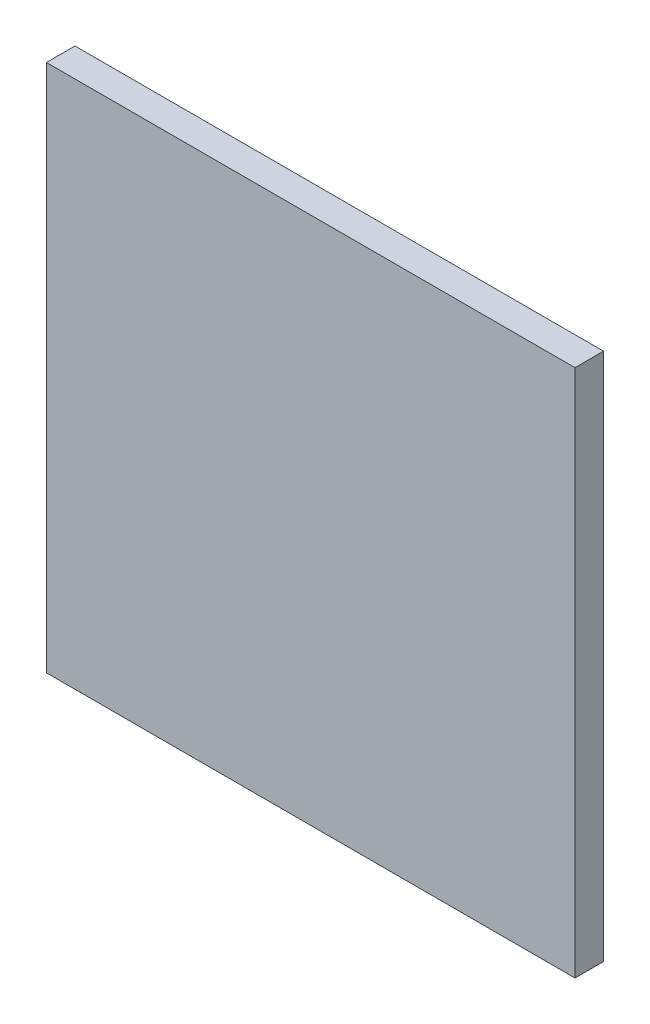
ISO-10303-21;
HEADER;
FILE_DESCRIPTION(('STEP AP214'),'2;1');
FILE_NAME('part.step','',(''),(''),'','','');
FILE_SCHEMA(('AUTOMOTIVE_DESIGN { 1 0 10303 214 1 1 1 1 }'));
ENDSEC;
DATA;
#1=APPLICATION_CONTEXT('core data for automotive mechanical design processes');
#2=APPLICATION_PROTOCOL_DEFINITION('international standard','automotive_design',2000,#1);
#3=PRODUCT_CONTEXT('',#1,'mechanical');
#4=PRODUCT('Part','Part','',(#3));
#5=PRODUCT_RELATED_PRODUCT_CATEGORY('part','',(#4));
#6=PRODUCT_DEFINITION_FORMATION('','',#4);
#7=PRODUCT_DEFINITION_CONTEXT('part definition',#1,'design');
#8=PRODUCT_DEFINITION('design','',#6,#7);
#9=PRODUCT_DEFINITION_SHAPE('','',#8);
#10=(LENGTH_UNIT() NAMED_UNIT(*) SI_UNIT(.MILLI.,.METRE.));
#11=(NAMED_UNIT(*) PLANE_ANGLE_UNIT() SI_UNIT($,.RADIAN.));
#12=(NAMED_UNIT(*) SI_UNIT($,.STERADIAN.) SOLID_ANGLE_UNIT());
#13=UNCERTAINTY_MEASURE_WITH_UNIT(LENGTH_MEASURE(1.E-05),#10,'distance_accuracy_value','');
#14=(GEOMETRIC_REPRESENTATION_CONTEXT(3) GLOBAL_UNCERTAINTY_ASSIGNED_CONTEXT((#13)) GLOBAL_UNIT_ASSIGNED_CONTEXT((#10,
#11,#12)) REPRESENTATION_CONTEXT('',''));
#15=CARTESIAN_POINT('',(0.,0.,0.));
#16=DIRECTION('',(0.,0.,1.));
#17=DIRECTION('',(1.,0.,0.));
#18=AXIS2_PLACEMENT_3D('',#15,#16,#17);
#19=CARTESIAN_POINT('',(605.123437974677,694.281976166603,20.));
#20=DIRECTION('',(0.,1.,0.));
#21=DIRECTION('',(0.,0.,1.));
#22=AXIS2_PLACEMENT_3D('',#19,#20,#21);
#23=PLANE('',#22);
#24=DIRECTION('',(1.,0.,0.));
#25=VECTOR('',#24,1.);
#26=CARTESIAN_POINT('',(605.123437974677,694.281976166603,0.));
#27=LINE('',#26,#25);
#28=CARTESIAN_POINT('',(605.123437974677,694.281976166603,0.));
#29=VERTEX_POINT('',#28);
#30=CARTESIAN_POINT('',(975.123437974677,694.281976166603,0.));
#31=VERTEX_POINT('',#30);
#32=EDGE_CURVE('E102',#29,#31,#27,.T.);
#33=ORIENTED_EDGE('',*,*,#32,.F.);
#34=DIRECTION('',(0.,0.,-1.));
#35=VECTOR('',#34,1.);
#36=CARTESIAN_POINT('',(605.123437974677,694.281976166603,20.));
#37=LINE('',#36,#35);
#38=CARTESIAN_POINT('',(605.123437974677,694.281976166603,20.));
#39=VERTEX_POINT('',#38);
#40=EDGE_CURVE('E11',#39,#29,#37,.T.);
#41=ORIENTED_EDGE('',*,*,#40,.F.);
#42=DIRECTION('',(1.,0.,0.));
#43=VECTOR('',#42,1.);
#44=CARTESIAN_POINT('',(605.123437974677,694.281976166603,20.));
#45=LINE('',#44,#43);
#46=CARTESIAN_POINT('',(975.123437974677,694.281976166603,20.));
#47=VERTEX_POINT('',#46);
#48=EDGE_CURVE('E96',#39,#47,#45,.T.);
#49=ORIENTED_EDGE('',*,*,#48,.T.);
#50=DIRECTION('',(0.,0.,-1.));
#51=VECTOR('',#50,1.);
#52=CARTESIAN_POINT('',(975.123437974677,694.281976166603,20.));
#53=LINE('',#52,#51);
#54=EDGE_CURVE('E41',#47,#31,#53,.T.);
#55=ORIENTED_EDGE('',*,*,#54,.T.);
#56=EDGE_LOOP('',(#33,#41,#49,#55));
#57=FACE_BOUND('',#56,.T.);
#58=ADVANCED_FACE('F38',(#57),#23,.T.);
#59=CARTESIAN_POINT('',(605.123437974677,324.281976166603,20.));
#60=DIRECTION('',(-1.,0.,0.));
#61=DIRECTION('',(0.,0.,1.));
#62=AXIS2_PLACEMENT_3D('',#59,#60,#61);
#63=PLANE('',#62);
#64=DIRECTION('',(0.,1.,0.));
#65=VECTOR('',#64,1.);
#66=CARTESIAN_POINT('',(605.123437974677,324.281976166603,0.));
#67=LINE('',#66,#65);
#68=CARTESIAN_POINT('',(605.123437974677,324.281976166603,0.));
#69=VERTEX_POINT('',#68);
#70=EDGE_CURVE('E98',#69,#29,#67,.T.);
#71=ORIENTED_EDGE('',*,*,#70,.F.);
#72=DIRECTION('',(0.,0.,-1.));
#73=VECTOR('',#72,1.);
#74=CARTESIAN_POINT('',(605.123437974677,324.281976166603,20.));
#75=LINE('',#74,#73);
#76=CARTESIAN_POINT('',(605.123437974677,324.281976166603,20.));
#77=VERTEX_POINT('',#76);
#78=EDGE_CURVE('E47',#77,#69,#75,.T.);
#79=ORIENTED_EDGE('',*,*,#78,.F.);
#80=DIRECTION('',(0.,1.,0.));
#81=VECTOR('',#80,1.);
#82=CARTESIAN_POINT('',(605.123437974677,324.281976166603,20.));
#83=LINE('',#82,#81);
#84=EDGE_CURVE('E93',#77,#39,#83,.T.);
#85=ORIENTED_EDGE('',*,*,#84,.T.);
#86=ORIENTED_EDGE('',*,*,#40,.T.);
#87=EDGE_LOOP('',(#71,#79,#85,#86));
#88=FACE_BOUND('',#87,.T.);
#89=ADVANCED_FACE('F112',(#88),#63,.T.);
#90=CARTESIAN_POINT('',(975.123437974677,324.281976166603,20.));
#91=DIRECTION('',(0.,-1.,0.));
#92=DIRECTION('',(1.,0.,0.));
#93=AXIS2_PLACEMENT_3D('',#90,#91,#92);
#94=PLANE('',#93);
#95=DIRECTION('',(-1.,0.,0.));
#96=VECTOR('',#95,1.);
#97=CARTESIAN_POINT('',(975.123437974677,324.281976166603,0.));
#98=LINE('',#97,#96);
#99=CARTESIAN_POINT('',(975.123437974677,324.281976166603,0.));
#100=VERTEX_POINT('',#99);
#101=EDGE_CURVE('E88',#100,#69,#98,.T.);
#102=ORIENTED_EDGE('',*,*,#101,.F.);
#103=DIRECTION('',(0.,0.,-1.));
#104=VECTOR('',#103,1.);
#105=CARTESIAN_POINT('',(975.123437974677,324.281976166603,20.));
#106=LINE('',#105,#104);
#107=CARTESIAN_POINT('',(975.123437974677,324.281976166603,20.));
#108=VERTEX_POINT('',#107);
#109=EDGE_CURVE('E83',#108,#100,#106,.T.);
#110=ORIENTED_EDGE('',*,*,#109,.F.);
#111=DIRECTION('',(-1.,0.,0.));
#112=VECTOR('',#111,1.);
#113=CARTESIAN_POINT('',(975.123437974677,324.281976166603,20.));
#114=LINE('',#113,#112);
#115=EDGE_CURVE('E86',#108,#77,#114,.T.);
#116=ORIENTED_EDGE('',*,*,#115,.T.);
#117=ORIENTED_EDGE('',*,*,#78,.T.);
#118=EDGE_LOOP('',(#102,#110,#116,#117));
#119=FACE_BOUND('',#118,.T.);
#120=ADVANCED_FACE('F85',(#119),#94,.T.);
#121=CARTESIAN_POINT('',(975.123437974677,694.281976166603,20.));
#122=DIRECTION('',(1.,0.,0.));
#123=DIRECTION('',(0.,1.,0.));
#124=AXIS2_PLACEMENT_3D('',#121,#122,#123);
#125=PLANE('',#124);
#126=DIRECTION('',(0.,-1.,0.));
#127=VECTOR('',#126,1.);
#128=CARTESIAN_POINT('',(975.123437974677,694.281976166603,0.));
#129=LINE('',#128,#127);
#130=EDGE_CURVE('E105',#31,#100,#129,.T.);
#131=ORIENTED_EDGE('',*,*,#130,.F.);
#132=ORIENTED_EDGE('',*,*,#54,.F.);
#133=DIRECTION('',(0.,-1.,0.));
#134=VECTOR('',#133,1.);
#135=CARTESIAN_POINT('',(975.123437974677,694.281976166603,20.));
#136=LINE('',#135,#134);
#137=EDGE_CURVE('E92',#47,#108,#136,.T.);
#138=ORIENTED_EDGE('',*,*,#137,.T.);
#139=ORIENTED_EDGE('',*,*,#109,.T.);
#140=EDGE_LOOP('',(#131,#132,#138,#139));
#141=FACE_BOUND('',#140,.T.);
#142=ADVANCED_FACE('F95',(#141),#125,.T.);
#143=CARTESIAN_POINT('',(0.,0.,20.));
#144=DIRECTION('',(0.,0.,-1.));
#145=DIRECTION('',(-1.,0.,0.));
#146=AXIS2_PLACEMENT_3D('',#143,#144,#145);
#147=PLANE('',#146);
#148=ORIENTED_EDGE('',*,*,#48,.F.);
#149=ORIENTED_EDGE('',*,*,#84,.F.);
#150=ORIENTED_EDGE('',*,*,#115,.F.);
#151=ORIENTED_EDGE('',*,*,#137,.F.);
#152=EDGE_LOOP('',(#148,#149,#150,#151));
#153=FACE_BOUND('',#152,.T.);
#154=ADVANCED_FACE('F91',(#153),#147,.F.);
#155=CARTESIAN_POINT('',(0.,0.,0.));
#156=DIRECTION('',(0.,0.,-1.));
#157=DIRECTION('',(-1.,0.,0.));
#158=AXIS2_PLACEMENT_3D('',#155,#156,#157);
#159=PLANE('',#158);
#160=ORIENTED_EDGE('',*,*,#32,.T.);
#161=ORIENTED_EDGE('',*,*,#130,.T.);
#162=ORIENTED_EDGE('',*,*,#101,.T.);
#163=ORIENTED_EDGE('',*,*,#70,.T.);
#164=EDGE_LOOP('',(#160,#161,#162,#163));
#165=FACE_BOUND('',#164,.T.);
#166=ADVANCED_FACE('F111',(#165),#159,.T.);
#167=CLOSED_SHELL('',(#58,#89,#120,#142,#154,#166));
#168=MANIFOLD_SOLID_BREP('B2',#167);
#169=ADVANCED_BREP_SHAPE_REPRESENTATION('',(#18,#168),#14);
#170=SHAPE_DEFINITION_REPRESENTATION(#9,#169);
ENDSEC;
END-ISO-10303-21;
